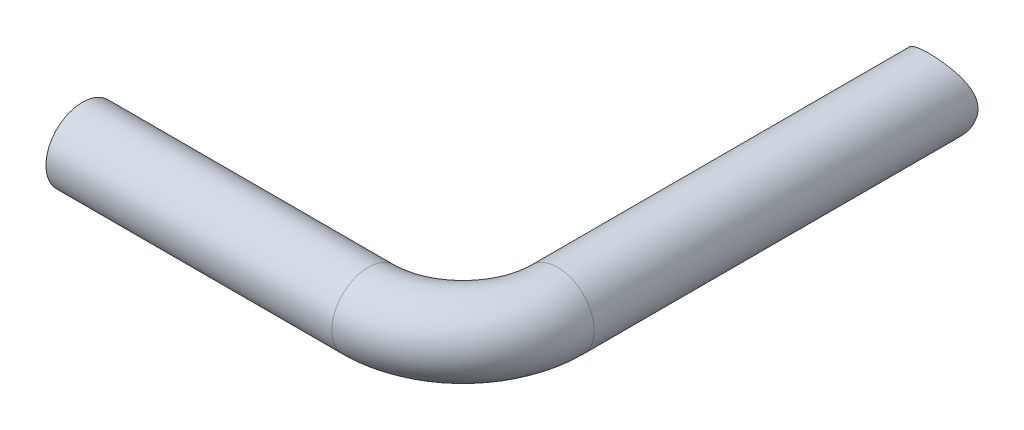
ISO-10303-21;
HEADER;
FILE_DESCRIPTION(('STEP AP214'),'2;1');
FILE_NAME('part.step','',(''),(''),'','','');
FILE_SCHEMA(('AUTOMOTIVE_DESIGN { 1 0 10303 214 1 1 1 1 }'));
ENDSEC;
DATA;
#1=APPLICATION_CONTEXT('core data for automotive mechanical design processes');
#2=APPLICATION_PROTOCOL_DEFINITION('international standard','automotive_design',2000,#1);
#3=PRODUCT_CONTEXT('',#1,'mechanical');
#4=PRODUCT('Part','Part','',(#3));
#5=PRODUCT_RELATED_PRODUCT_CATEGORY('part','',(#4));
#6=PRODUCT_DEFINITION_FORMATION('','',#4);
#7=PRODUCT_DEFINITION_CONTEXT('part definition',#1,'design');
#8=PRODUCT_DEFINITION('design','',#6,#7);
#9=PRODUCT_DEFINITION_SHAPE('','',#8);
#10=(LENGTH_UNIT() NAMED_UNIT(*) SI_UNIT(.MILLI.,.METRE.));
#11=(NAMED_UNIT(*) PLANE_ANGLE_UNIT() SI_UNIT($,.RADIAN.));
#12=(NAMED_UNIT(*) SI_UNIT($,.STERADIAN.) SOLID_ANGLE_UNIT());
#13=UNCERTAINTY_MEASURE_WITH_UNIT(LENGTH_MEASURE(1.E-05),#10,'distance_accuracy_value','');
#14=(GEOMETRIC_REPRESENTATION_CONTEXT(3) GLOBAL_UNCERTAINTY_ASSIGNED_CONTEXT((#13)) GLOBAL_UNIT_ASSIGNED_CONTEXT((#10,
#11,#12)) REPRESENTATION_CONTEXT('',''));
#15=CARTESIAN_POINT('',(0.,0.,0.));
#16=DIRECTION('',(0.,0.,1.));
#17=DIRECTION('',(1.,0.,0.));
#18=AXIS2_PLACEMENT_3D('',#15,#16,#17);
#19=CARTESIAN_POINT('',(55.16,-0.61,-6.2));
#20=DIRECTION('',(-1.,0.,0.));
#21=DIRECTION('',(0.,0.,1.));
#22=AXIS2_PLACEMENT_3D('',#19,#20,#21);
#23=PLANE('',#22);
#24=CARTESIAN_POINT('',(55.16,-0.61,-6.2));
#25=DIRECTION('',(1.,0.,0.));
#26=DIRECTION('',(0.,0.,-1.));
#27=AXIS2_PLACEMENT_3D('',#24,#25,#26);
#28=CIRCLE('',#27,0.51);
#29=CARTESIAN_POINT('',(55.16,-0.61,-6.71));
#30=VERTEX_POINT('',#29);
#31=EDGE_CURVE('E17',#30,#30,#28,.T.);
#32=ORIENTED_EDGE('',*,*,#31,.F.);
#33=EDGE_LOOP('',(#32));
#34=FACE_BOUND('',#33,.T.);
#35=ADVANCED_FACE('F14',(#34),#23,.T.);
#36=CARTESIAN_POINT('',(57.16,-0.61,-6.2));
#37=DIRECTION('',(1.,0.,0.));
#38=DIRECTION('',(0.,0.,-1.));
#39=AXIS2_PLACEMENT_3D('',#36,#37,#38);
#40=CYLINDRICAL_SURFACE('',#39,0.51);
#41=CARTESIAN_POINT('',(59.16,-0.61,-6.2));
#42=DIRECTION('',(-1.,0.,0.));
#43=DIRECTION('',(0.,0.,1.));
#44=AXIS2_PLACEMENT_3D('',#41,#42,#43);
#45=CIRCLE('',#44,0.51);
#46=CARTESIAN_POINT('',(59.16,-0.61,-5.69));
#47=VERTEX_POINT('',#46);
#48=EDGE_CURVE('E25',#47,#47,#45,.F.);
#49=ORIENTED_EDGE('',*,*,#48,.F.);
#50=EDGE_LOOP('',(#49));
#51=FACE_BOUND('',#50,.T.);
#52=ORIENTED_EDGE('',*,*,#31,.T.);
#53=EDGE_LOOP('',(#52));
#54=FACE_BOUND('',#53,.T.);
#55=ADVANCED_FACE('F50',(#51,#54),#40,.T.);
#56=CARTESIAN_POINT('',(59.16,-0.61,-7.526));
#57=DIRECTION('',(0.,-1.,0.));
#58=DIRECTION('',(0.,0.,-1.));
#59=AXIS2_PLACEMENT_3D('',#56,#57,#58);
#60=TOROIDAL_SURFACE('',#59,1.326,0.51);
#61=CARTESIAN_POINT('',(60.486,-0.61,-7.526));
#62=DIRECTION('',(0.,0.,1.));
#63=DIRECTION('',(1.,0.,0.));
#64=AXIS2_PLACEMENT_3D('',#61,#62,#63);
#65=CIRCLE('',#64,0.51);
#66=CARTESIAN_POINT('',(60.996,-0.61,-7.526));
#67=VERTEX_POINT('',#66);
#68=EDGE_CURVE('E21',#67,#67,#65,.F.);
#69=ORIENTED_EDGE('',*,*,#68,.F.);
#70=EDGE_LOOP('',(#69));
#71=FACE_BOUND('',#70,.T.);
#72=ORIENTED_EDGE('',*,*,#48,.T.);
#73=EDGE_LOOP('',(#72));
#74=FACE_BOUND('',#73,.T.);
#75=ADVANCED_FACE('F44',(#71,#74),#60,.T.);
#76=CARTESIAN_POINT('',(60.486,-3.59,-13.526));
#77=DIRECTION('',(0.,1.,0.));
#78=DIRECTION('',(0.,0.,1.));
#79=AXIS2_PLACEMENT_3D('',#76,#77,#78);
#80=CYLINDRICAL_SURFACE('',#79,0.81);
#81=CARTESIAN_POINT('',(59.976,-0.61,-12.8967146910979));
#82=CARTESIAN_POINT('',(59.9759997761433,-0.635334210969195,-12.8967149489499));
#83=CARTESIAN_POINT('',(59.9779010172212,-0.660667409048046,-12.8951597899086));
#84=CARTESIAN_POINT('',(59.9853572620148,-0.710462155062799,-12.8892282279419));
#85=CARTESIAN_POINT('',(59.9909173069612,-0.734922451190748,-12.8848479326085));
#86=CARTESIAN_POINT('',(60.0052930260327,-0.782120557410308,-12.8740029849945));
#87=CARTESIAN_POINT('',(60.0140818475271,-0.804870761239623,-12.8675555789238));
#88=CARTESIAN_POINT('',(60.034583664298,-0.848549846927483,-12.8533345733677));
#89=CARTESIAN_POINT('',(60.0462974192037,-0.869478253743271,-12.845560629536));
#90=CARTESIAN_POINT('',(60.0741756029477,-0.912048561052361,-12.8282862326412));
#91=CARTESIAN_POINT('',(60.0907290563491,-0.933398860793801,-12.8186948821032));
#92=CARTESIAN_POINT('',(60.1270230828519,-0.973267117125198,-12.7996000690801));
#93=CARTESIAN_POINT('',(60.1467663524456,-0.991782651342423,-12.7900966882097));
#94=CARTESIAN_POINT('',(60.1918210717331,-1.02771688783599,-12.7708646167298));
#95=CARTESIAN_POINT('',(60.217518804486,-1.04471981769079,-12.7612522665343));
#96=CARTESIAN_POINT('',(60.2721310591059,-1.07402283260454,-12.7442231292696));
#97=CARTESIAN_POINT('',(60.3010423109766,-1.08632764280083,-12.7368041379324));
#98=CARTESIAN_POINT('',(60.3581250431494,-1.10452059545482,-12.725684733029));
#99=CARTESIAN_POINT('',(60.3860669067395,-1.11093843744663,-12.7216803951886));
#100=CARTESIAN_POINT('',(60.4428851671013,-1.11898101270464,-12.7166476129646));
#101=CARTESIAN_POINT('',(60.4717605293049,-1.12061087987497,-12.7156159811206));
#102=CARTESIAN_POINT('',(60.525375294758,-1.11908663661352,-12.7165745246627));
#103=CARTESIAN_POINT('',(60.5501425837568,-1.11655361443703,-12.7181724280022));
#104=CARTESIAN_POINT('',(60.5988181539218,-1.10797856390051,-12.7235217323125));
#105=CARTESIAN_POINT('',(60.6227263706862,-1.10193627304231,-12.7272732943796));
#106=CARTESIAN_POINT('',(60.6691378579039,-1.08661257963502,-12.7366187494499));
#107=CARTESIAN_POINT('',(60.6916383532145,-1.07732500280611,-12.7422161530867));
#108=CARTESIAN_POINT('',(60.7347773193559,-1.05585975221759,-12.7548219834353));
#109=CARTESIAN_POINT('',(60.7554153604729,-1.04368141382959,-12.7618307345803));
#110=CARTESIAN_POINT('',(60.79701938943,-1.01507028966428,-12.7777201442668));
#111=CARTESIAN_POINT('',(60.8177022670968,-0.998295577281929,-12.7867253191299));
#112=CARTESIAN_POINT('',(60.8561393055623,-0.961851982224756,-12.8051998847767));
#113=CARTESIAN_POINT('',(60.8738892694353,-0.942179027042251,-12.8146699160667));
#114=CARTESIAN_POINT('',(60.9083635080183,-0.897420033233039,-12.8345127856824));
#115=CARTESIAN_POINT('',(60.924636535167,-0.871962023167097,-12.8448379423213));
#116=CARTESIAN_POINT('',(60.952621710884,-0.818045972948543,-12.8636935970536));
#117=CARTESIAN_POINT('',(60.9643404422018,-0.789592338877654,-12.8722266771358));
#118=CARTESIAN_POINT('',(60.9808101541739,-0.736045381179701,-12.8846353596122));
#119=CARTESIAN_POINT('',(60.9864719037548,-0.711371265076985,-12.88909340143));
#120=CARTESIAN_POINT('',(60.9940633625303,-0.661129963335891,-12.8951303518989));
#121=CARTESIAN_POINT('',(60.9959997741087,-0.635564465975083,-12.8967144309024));
#122=CARTESIAN_POINT('',(60.9960002238567,-0.584665789030803,-12.8967149489499));
#123=CARTESIAN_POINT('',(60.9940989827788,-0.559332590951952,-12.8951597899086));
#124=CARTESIAN_POINT('',(60.9866427379852,-0.509537844937199,-12.8892282279419));
#125=CARTESIAN_POINT('',(60.9810826930388,-0.485077548809251,-12.8848479326085));
#126=CARTESIAN_POINT('',(60.9667069739673,-0.437879442589692,-12.8740029849945));
#127=CARTESIAN_POINT('',(60.9579181524729,-0.415129238760377,-12.8675555789238));
#128=CARTESIAN_POINT('',(60.937416335702,-0.371450153072516,-12.8533345733677));
#129=CARTESIAN_POINT('',(60.9257025807963,-0.350521746256729,-12.845560629536));
#130=CARTESIAN_POINT('',(60.8978243970523,-0.307951438947638,-12.8282862326412));
#131=CARTESIAN_POINT('',(60.8812709436509,-0.286601139206198,-12.8186948821032));
#132=CARTESIAN_POINT('',(60.8449769171481,-0.246732882874802,-12.7996000690801));
#133=CARTESIAN_POINT('',(60.8252336475543,-0.228217348657577,-12.7900966882097));
#134=CARTESIAN_POINT('',(60.7801789282669,-0.192283112164012,-12.7708646167298));
#135=CARTESIAN_POINT('',(60.754481195514,-0.175280182309212,-12.7612522665343));
#136=CARTESIAN_POINT('',(60.6998689408941,-0.145977167395461,-12.7442231292696));
#137=CARTESIAN_POINT('',(60.6709576890234,-0.133672357199167,-12.7368041379324));
#138=CARTESIAN_POINT('',(60.6138749568506,-0.115479404545182,-12.725684733029));
#139=CARTESIAN_POINT('',(60.5859330932605,-0.109061562553365,-12.7216803951886));
#140=CARTESIAN_POINT('',(60.5291148328987,-0.101018987295363,-12.7166476129646));
#141=CARTESIAN_POINT('',(60.5002394706951,-0.0993891201250344,-12.7156159811206));
#142=CARTESIAN_POINT('',(60.446624705242,-0.100913363386476,-12.7165745246627));
#143=CARTESIAN_POINT('',(60.4218574162432,-0.103446385562968,-12.7181724280022));
#144=CARTESIAN_POINT('',(60.3731818460782,-0.112021436099489,-12.7235217323125));
#145=CARTESIAN_POINT('',(60.3492736293138,-0.118063726957692,-12.7272732943796));
#146=CARTESIAN_POINT('',(60.3028621420961,-0.133387420364981,-12.7366187494499));
#147=CARTESIAN_POINT('',(60.2803616467855,-0.142674997193891,-12.7422161530867));
#148=CARTESIAN_POINT('',(60.2372226806441,-0.164140247782414,-12.7548219834353));
#149=CARTESIAN_POINT('',(60.2165846395271,-0.176318586170413,-12.7618307345803));
#150=CARTESIAN_POINT('',(60.17498061057,-0.204929710335716,-12.7777201442668));
#151=CARTESIAN_POINT('',(60.1542977329032,-0.221704422718071,-12.7867253191299));
#152=CARTESIAN_POINT('',(60.1158606944377,-0.258148017775244,-12.8051998847767));
#153=CARTESIAN_POINT('',(60.0981107305647,-0.277820972957748,-12.8146699160667));
#154=CARTESIAN_POINT('',(60.0636364919817,-0.322579966766961,-12.8345127856824));
#155=CARTESIAN_POINT('',(60.047363464833,-0.348037976832903,-12.8448379423213));
#156=CARTESIAN_POINT('',(60.019378289116,-0.401954027051457,-12.8636935970536));
#157=CARTESIAN_POINT('',(60.0076595577982,-0.430407661122346,-12.8722266771358));
#158=CARTESIAN_POINT('',(59.9911898458261,-0.483954618820299,-12.8846353596122));
#159=CARTESIAN_POINT('',(59.9855280962452,-0.508628734923016,-12.88909340143));
#160=CARTESIAN_POINT('',(59.9779366374697,-0.558870036664109,-12.8951303518989));
#161=CARTESIAN_POINT('',(59.9760002258913,-0.584435534024916,-12.8967144309024));
#162=CARTESIAN_POINT('',(59.976,-0.61,-12.8967146910979));
#163=B_SPLINE_CURVE_WITH_KNOTS('',3,(#81,#82,#83,#84,#85,#86,#87,#88,#89,#90,#91,#92,#93,#94,
#95,#96,#97,#98,#99,#100,#101,#102,#103,#104,#105,#106,#107,#108,#109,#110,#111,#112,#113,#114,
#115,#116,#117,#118,#119,#120,#121,#122,#123,#124,#125,#126,#127,#128,#129,#130,#131,#132,#133,
#134,#135,#136,#137,#138,#139,#140,#141,#142,#143,#144,#145,#146,#147,#148,#149,#150,#151,#152,
#153,#154,#155,#156,#157,#158,#159,#160,#161,#162),.UNSPECIFIED.,.T.,.F.,(4,2,2,2,2,2,2,2,2,2,2,
2,2,2,2,2,2,2,2,2,2,2,2,2,2,2,2,2,2,2,2,2,2,2,2,2,2,2,2,2,4),(0.,0.0758914821020507,
0.151887749757778,0.227265784747847,0.302663416428803,0.388338477657202,0.47408634642438,
0.570392434373,0.666601405644626,0.752917585622716,0.839141179267412,0.913626180330791,
0.98811675369347,1.06274982685915,1.13740007590934,1.22140681777028,1.30553274917159,
1.4008598920815,1.49604873271247,1.57276812767887,1.64934936458243,1.72524084668448,
1.8012371143402,1.87661514933027,1.95201278101123,2.03768784223963,2.12343571100681,
2.21974179895543,2.31595077022705,2.40226695020514,2.48849054384984,2.56297554491322,
2.6374661182759,2.71209919144157,2.78674944049176,2.87075618235271,2.95488211375401,
3.05020925666392,3.1453980972949,3.2221174922613,3.29869872916486),.UNSPECIFIED.);
#164=CARTESIAN_POINT('',(59.976,-0.61,-12.8967146910979));
#165=VERTEX_POINT('',#164);
#166=EDGE_CURVE('E10',#165,#165,#163,.T.);
#167=ORIENTED_EDGE('',*,*,#166,.F.);
#168=EDGE_LOOP('',(#167));
#169=FACE_BOUND('',#168,.T.);
#170=ADVANCED_FACE('F33',(#169),#80,.F.);
#171=CARTESIAN_POINT('',(60.486,-0.61,-9.526));
#172=DIRECTION('',(0.,0.,1.));
#173=DIRECTION('',(1.,0.,0.));
#174=AXIS2_PLACEMENT_3D('',#171,#172,#173);
#175=CYLINDRICAL_SURFACE('',#174,0.51);
#176=ORIENTED_EDGE('',*,*,#68,.T.);
#177=EDGE_LOOP('',(#176));
#178=FACE_BOUND('',#177,.T.);
#179=ORIENTED_EDGE('',*,*,#166,.T.);
#180=EDGE_LOOP('',(#179));
#181=FACE_BOUND('',#180,.T.);
#182=ADVANCED_FACE('F36',(#178,#181),#175,.T.);
#183=CLOSED_SHELL('',(#35,#55,#75,#170,#182));
#184=MANIFOLD_SOLID_BREP('B1',#183);
#185=ADVANCED_BREP_SHAPE_REPRESENTATION('',(#18,#184),#14);
#186=SHAPE_DEFINITION_REPRESENTATION(#9,#185);
ENDSEC;
END-ISO-10303-21;
